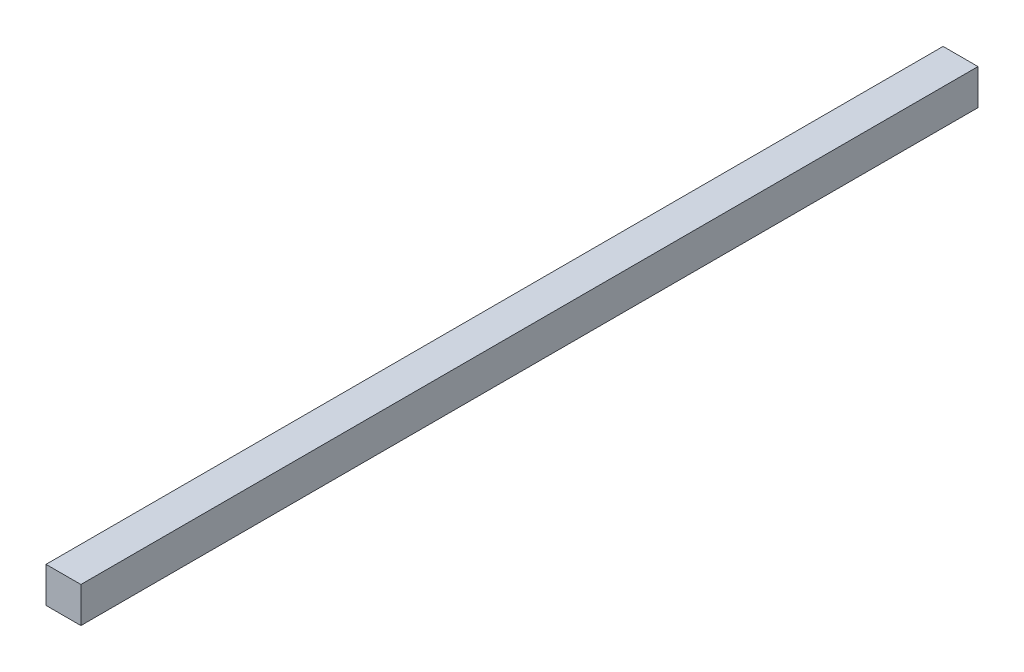
ISO-10303-21;
HEADER;
FILE_DESCRIPTION(('STEP AP214'),'2;1');
FILE_NAME('part.step','',(''),(''),'','','');
FILE_SCHEMA(('AUTOMOTIVE_DESIGN { 1 0 10303 214 1 1 1 1 }'));
ENDSEC;
DATA;
#1=APPLICATION_CONTEXT('core data for automotive mechanical design processes');
#2=APPLICATION_PROTOCOL_DEFINITION('international standard','automotive_design',2000,#1);
#3=PRODUCT_CONTEXT('',#1,'mechanical');
#4=PRODUCT('Part','Part','',(#3));
#5=PRODUCT_RELATED_PRODUCT_CATEGORY('part','',(#4));
#6=PRODUCT_DEFINITION_FORMATION('','',#4);
#7=PRODUCT_DEFINITION_CONTEXT('part definition',#1,'design');
#8=PRODUCT_DEFINITION('design','',#6,#7);
#9=PRODUCT_DEFINITION_SHAPE('','',#8);
#10=(LENGTH_UNIT() NAMED_UNIT(*) SI_UNIT(.MILLI.,.METRE.));
#11=(NAMED_UNIT(*) PLANE_ANGLE_UNIT() SI_UNIT($,.RADIAN.));
#12=(NAMED_UNIT(*) SI_UNIT($,.STERADIAN.) SOLID_ANGLE_UNIT());
#13=UNCERTAINTY_MEASURE_WITH_UNIT(LENGTH_MEASURE(1.E-05),#10,'distance_accuracy_value','');
#14=(GEOMETRIC_REPRESENTATION_CONTEXT(3) GLOBAL_UNCERTAINTY_ASSIGNED_CONTEXT((#13)) GLOBAL_UNIT_ASSIGNED_CONTEXT((#10,
#11,#12)) REPRESENTATION_CONTEXT('',''));
#15=CARTESIAN_POINT('',(0.,0.,0.));
#16=DIRECTION('',(0.,0.,1.));
#17=DIRECTION('',(1.,0.,0.));
#18=AXIS2_PLACEMENT_3D('',#15,#16,#17);
#19=CARTESIAN_POINT('',(5.83688894539378,-5.95352309929496,300.));
#20=DIRECTION('',(-1.,0.,0.));
#21=DIRECTION('',(0.,0.,1.));
#22=AXIS2_PLACEMENT_3D('',#19,#20,#21);
#23=PLANE('',#22);
#24=DIRECTION('',(0.,1.,0.));
#25=VECTOR('',#24,1.);
#26=CARTESIAN_POINT('',(5.83688894539378,-5.95352309929496,0.));
#27=LINE('',#26,#25);
#28=CARTESIAN_POINT('',(5.83688894539378,-5.95352309929496,0.));
#29=VERTEX_POINT('',#28);
#30=CARTESIAN_POINT('',(5.83688894539378,5.95352309929496,0.));
#31=VERTEX_POINT('',#30);
#32=EDGE_CURVE('E104',#29,#31,#27,.T.);
#33=ORIENTED_EDGE('',*,*,#32,.T.);
#34=DIRECTION('',(0.,0.,-1.));
#35=VECTOR('',#34,1.);
#36=CARTESIAN_POINT('',(5.83688894539378,5.95352309929496,300.));
#37=LINE('',#36,#35);
#38=CARTESIAN_POINT('',(5.83688894539378,5.95352309929496,300.));
#39=VERTEX_POINT('',#38);
#40=EDGE_CURVE('E11',#39,#31,#37,.T.);
#41=ORIENTED_EDGE('',*,*,#40,.F.);
#42=DIRECTION('',(0.,1.,0.));
#43=VECTOR('',#42,1.);
#44=CARTESIAN_POINT('',(5.83688894539378,-5.95352309929496,300.));
#45=LINE('',#44,#43);
#46=CARTESIAN_POINT('',(5.83688894539378,-5.95352309929496,300.));
#47=VERTEX_POINT('',#46);
#48=EDGE_CURVE('E92',#47,#39,#45,.T.);
#49=ORIENTED_EDGE('',*,*,#48,.F.);
#50=DIRECTION('',(0.,0.,-1.));
#51=VECTOR('',#50,1.);
#52=CARTESIAN_POINT('',(5.83688894539378,-5.95352309929496,300.));
#53=LINE('',#52,#51);
#54=EDGE_CURVE('E100',#47,#29,#53,.T.);
#55=ORIENTED_EDGE('',*,*,#54,.T.);
#56=EDGE_LOOP('',(#33,#41,#49,#55));
#57=FACE_BOUND('',#56,.T.);
#58=ADVANCED_FACE('F41',(#57),#23,.F.);
#59=CARTESIAN_POINT('',(-5.83688894539378,5.95352309929496,300.));
#60=DIRECTION('',(0.,-1.,0.));
#61=DIRECTION('',(0.,0.,-1.));
#62=AXIS2_PLACEMENT_3D('',#59,#60,#61);
#63=PLANE('',#62);
#64=DIRECTION('',(-1.,0.,0.));
#65=VECTOR('',#64,1.);
#66=CARTESIAN_POINT('',(-5.83688894539378,5.95352309929496,0.));
#67=LINE('',#66,#65);
#68=CARTESIAN_POINT('',(-5.83688894539378,5.95352309929496,0.));
#69=VERTEX_POINT('',#68);
#70=EDGE_CURVE('E96',#31,#69,#67,.T.);
#71=ORIENTED_EDGE('',*,*,#70,.T.);
#72=DIRECTION('',(0.,0.,-1.));
#73=VECTOR('',#72,1.);
#74=CARTESIAN_POINT('',(-5.83688894539378,5.95352309929496,300.));
#75=LINE('',#74,#73);
#76=CARTESIAN_POINT('',(-5.83688894539378,5.95352309929496,300.));
#77=VERTEX_POINT('',#76);
#78=EDGE_CURVE('E49',#77,#69,#75,.T.);
#79=ORIENTED_EDGE('',*,*,#78,.F.);
#80=DIRECTION('',(-1.,0.,0.));
#81=VECTOR('',#80,1.);
#82=CARTESIAN_POINT('',(-5.83688894539378,5.95352309929496,300.));
#83=LINE('',#82,#81);
#84=EDGE_CURVE('E87',#39,#77,#83,.T.);
#85=ORIENTED_EDGE('',*,*,#84,.F.);
#86=ORIENTED_EDGE('',*,*,#40,.T.);
#87=EDGE_LOOP('',(#71,#79,#85,#86));
#88=FACE_BOUND('',#87,.T.);
#89=ADVANCED_FACE('F95',(#88),#63,.F.);
#90=CARTESIAN_POINT('',(-5.83688894539378,-5.95352309929496,300.));
#91=DIRECTION('',(1.,0.,0.));
#92=DIRECTION('',(0.,0.,-1.));
#93=AXIS2_PLACEMENT_3D('',#90,#91,#92);
#94=PLANE('',#93);
#95=DIRECTION('',(0.,-1.,0.));
#96=VECTOR('',#95,1.);
#97=CARTESIAN_POINT('',(-5.83688894539378,-5.95352309929496,0.));
#98=LINE('',#97,#96);
#99=CARTESIAN_POINT('',(-5.83688894539378,-5.95352309929496,0.));
#100=VERTEX_POINT('',#99);
#101=EDGE_CURVE('E74',#69,#100,#98,.T.);
#102=ORIENTED_EDGE('',*,*,#101,.T.);
#103=DIRECTION('',(0.,0.,-1.));
#104=VECTOR('',#103,1.);
#105=CARTESIAN_POINT('',(-5.83688894539378,-5.95352309929496,300.));
#106=LINE('',#105,#104);
#107=CARTESIAN_POINT('',(-5.83688894539378,-5.95352309929496,300.));
#108=VERTEX_POINT('',#107);
#109=EDGE_CURVE('E97',#108,#100,#106,.T.);
#110=ORIENTED_EDGE('',*,*,#109,.F.);
#111=DIRECTION('',(0.,-1.,0.));
#112=VECTOR('',#111,1.);
#113=CARTESIAN_POINT('',(-5.83688894539378,-5.95352309929496,300.));
#114=LINE('',#113,#112);
#115=EDGE_CURVE('E90',#77,#108,#114,.T.);
#116=ORIENTED_EDGE('',*,*,#115,.F.);
#117=ORIENTED_EDGE('',*,*,#78,.T.);
#118=EDGE_LOOP('',(#102,#110,#116,#117));
#119=FACE_BOUND('',#118,.T.);
#120=ADVANCED_FACE('F98',(#119),#94,.F.);
#121=CARTESIAN_POINT('',(-5.83688894539378,-5.95352309929496,300.));
#122=DIRECTION('',(0.,1.,0.));
#123=DIRECTION('',(0.,0.,1.));
#124=AXIS2_PLACEMENT_3D('',#121,#122,#123);
#125=PLANE('',#124);
#126=DIRECTION('',(1.,0.,0.));
#127=VECTOR('',#126,1.);
#128=CARTESIAN_POINT('',(-5.83688894539378,-5.95352309929496,0.));
#129=LINE('',#128,#127);
#130=EDGE_CURVE('E80',#100,#29,#129,.T.);
#131=ORIENTED_EDGE('',*,*,#130,.T.);
#132=ORIENTED_EDGE('',*,*,#54,.F.);
#133=DIRECTION('',(1.,0.,0.));
#134=VECTOR('',#133,1.);
#135=CARTESIAN_POINT('',(-5.83688894539378,-5.95352309929496,300.));
#136=LINE('',#135,#134);
#137=EDGE_CURVE('E57',#108,#47,#136,.T.);
#138=ORIENTED_EDGE('',*,*,#137,.F.);
#139=ORIENTED_EDGE('',*,*,#109,.T.);
#140=EDGE_LOOP('',(#131,#132,#138,#139));
#141=FACE_BOUND('',#140,.T.);
#142=ADVANCED_FACE('F111',(#141),#125,.F.);
#143=CARTESIAN_POINT('',(0.,0.,300.));
#144=DIRECTION('',(0.,0.,-1.));
#145=DIRECTION('',(-1.,0.,0.));
#146=AXIS2_PLACEMENT_3D('',#143,#144,#145);
#147=PLANE('',#146);
#148=ORIENTED_EDGE('',*,*,#48,.T.);
#149=ORIENTED_EDGE('',*,*,#84,.T.);
#150=ORIENTED_EDGE('',*,*,#115,.T.);
#151=ORIENTED_EDGE('',*,*,#137,.T.);
#152=EDGE_LOOP('',(#148,#149,#150,#151));
#153=FACE_BOUND('',#152,.T.);
#154=ADVANCED_FACE('F88',(#153),#147,.F.);
#155=CARTESIAN_POINT('',(0.,0.,0.));
#156=DIRECTION('',(0.,0.,-1.));
#157=DIRECTION('',(-1.,0.,0.));
#158=AXIS2_PLACEMENT_3D('',#155,#156,#157);
#159=PLANE('',#158);
#160=ORIENTED_EDGE('',*,*,#32,.F.);
#161=ORIENTED_EDGE('',*,*,#130,.F.);
#162=ORIENTED_EDGE('',*,*,#101,.F.);
#163=ORIENTED_EDGE('',*,*,#70,.F.);
#164=EDGE_LOOP('',(#160,#161,#162,#163));
#165=FACE_BOUND('',#164,.T.);
#166=ADVANCED_FACE('F114',(#165),#159,.T.);
#167=CLOSED_SHELL('',(#58,#89,#120,#142,#154,#166));
#168=MANIFOLD_SOLID_BREP('B2',#167);
#169=ADVANCED_BREP_SHAPE_REPRESENTATION('',(#18,#168),#14);
#170=SHAPE_DEFINITION_REPRESENTATION(#9,#169);
ENDSEC;
END-ISO-10303-21;
